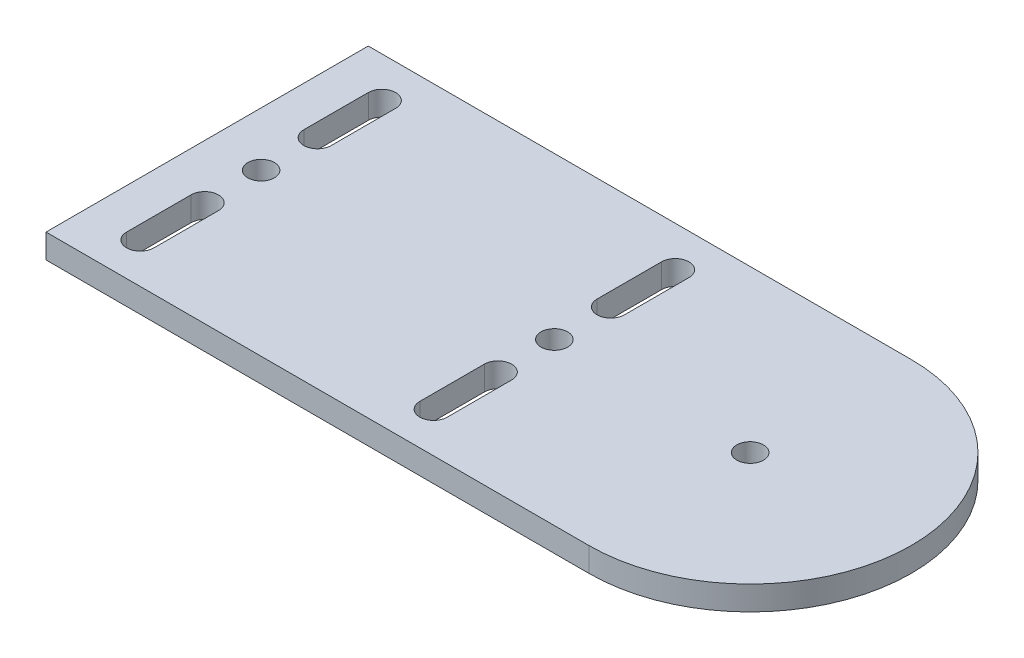
ISO-10303-21;
HEADER;
FILE_DESCRIPTION(('STEP AP214'),'2;1');
FILE_NAME('part.step','',(''),(''),'','','');
FILE_SCHEMA(('AUTOMOTIVE_DESIGN { 1 0 10303 214 1 1 1 1 }'));
ENDSEC;
DATA;
#1=APPLICATION_CONTEXT('core data for automotive mechanical design processes');
#2=APPLICATION_PROTOCOL_DEFINITION('international standard','automotive_design',2000,#1);
#3=PRODUCT_CONTEXT('',#1,'mechanical');
#4=PRODUCT('Part','Part','',(#3));
#5=PRODUCT_RELATED_PRODUCT_CATEGORY('part','',(#4));
#6=PRODUCT_DEFINITION_FORMATION('','',#4);
#7=PRODUCT_DEFINITION_CONTEXT('part definition',#1,'design');
#8=PRODUCT_DEFINITION('design','',#6,#7);
#9=PRODUCT_DEFINITION_SHAPE('','',#8);
#10=(LENGTH_UNIT() NAMED_UNIT(*) SI_UNIT(.MILLI.,.METRE.));
#11=(NAMED_UNIT(*) PLANE_ANGLE_UNIT() SI_UNIT($,.RADIAN.));
#12=(NAMED_UNIT(*) SI_UNIT($,.STERADIAN.) SOLID_ANGLE_UNIT());
#13=UNCERTAINTY_MEASURE_WITH_UNIT(LENGTH_MEASURE(1.E-05),#10,'distance_accuracy_value','');
#14=(GEOMETRIC_REPRESENTATION_CONTEXT(3) GLOBAL_UNCERTAINTY_ASSIGNED_CONTEXT((#13)) GLOBAL_UNIT_ASSIGNED_CONTEXT((#10,
#11,#12)) REPRESENTATION_CONTEXT('',''));
#15=CARTESIAN_POINT('',(0.,0.,0.));
#16=DIRECTION('',(0.,0.,1.));
#17=DIRECTION('',(1.,0.,0.));
#18=AXIS2_PLACEMENT_3D('',#15,#16,#17);
#19=CARTESIAN_POINT('',(0.,3.,0.));
#20=DIRECTION('',(0.,1.,0.));
#21=DIRECTION('',(0.,0.,1.));
#22=AXIS2_PLACEMENT_3D('',#19,#20,#21);
#23=PLANE('',#22);
#24=DIRECTION('',(0.,0.,-1.));
#25=VECTOR('',#24,1.);
#26=CARTESIAN_POINT('',(17.6,3.,0.));
#27=LINE('',#26,#25);
#28=CARTESIAN_POINT('',(17.6,3.,20.));
#29=VERTEX_POINT('',#28);
#30=CARTESIAN_POINT('',(17.6,3.,-20.));
#31=VERTEX_POINT('',#30);
#32=EDGE_CURVE('E49',#29,#31,#27,.T.);
#33=ORIENTED_EDGE('',*,*,#32,.F.);
#34=DIRECTION('',(1.,0.,0.));
#35=VECTOR('',#34,1.);
#36=CARTESIAN_POINT('',(0.,3.,20.));
#37=LINE('',#36,#35);
#38=CARTESIAN_POINT('',(85.,3.,20.));
#39=VERTEX_POINT('',#38);
#40=EDGE_CURVE('E182',#29,#39,#37,.T.);
#41=ORIENTED_EDGE('',*,*,#40,.T.);
#42=CARTESIAN_POINT('',(85.,3.,0.));
#43=DIRECTION('',(0.,1.,0.));
#44=DIRECTION('',(0.,0.,1.));
#45=AXIS2_PLACEMENT_3D('',#42,#43,#44);
#46=CIRCLE('',#45,20.);
#47=CARTESIAN_POINT('',(85.,3.,-20.));
#48=VERTEX_POINT('',#47);
#49=EDGE_CURVE('E339',#39,#48,#46,.T.);
#50=ORIENTED_EDGE('',*,*,#49,.T.);
#51=DIRECTION('',(-1.,0.,0.));
#52=VECTOR('',#51,1.);
#53=CARTESIAN_POINT('',(0.,3.,-20.));
#54=LINE('',#53,#52);
#55=EDGE_CURVE('E196',#48,#31,#54,.T.);
#56=ORIENTED_EDGE('',*,*,#55,.T.);
#57=EDGE_LOOP('',(#33,#41,#50,#56));
#58=FACE_BOUND('',#57,.T.);
#59=CARTESIAN_POINT('',(24.3,3.,0.));
#60=DIRECTION('',(0.,1.,0.));
#61=DIRECTION('',(0.,0.,1.));
#62=AXIS2_PLACEMENT_3D('',#59,#60,#61);
#63=CIRCLE('',#62,1.65);
#64=CARTESIAN_POINT('',(24.3,3.,1.65000000000001));
#65=VERTEX_POINT('',#64);
#66=EDGE_CURVE('E207',#65,#65,#63,.T.);
#67=ORIENTED_EDGE('',*,*,#66,.F.);
#68=EDGE_LOOP('',(#67));
#69=FACE_BOUND('',#68,.T.);
#70=CARTESIAN_POINT('',(60.7,3.,0.));
#71=DIRECTION('',(0.,1.,0.));
#72=DIRECTION('',(0.,0.,1.));
#73=AXIS2_PLACEMENT_3D('',#70,#71,#72);
#74=CIRCLE('',#73,1.65);
#75=CARTESIAN_POINT('',(60.7,3.,1.65000000000001));
#76=VERTEX_POINT('',#75);
#77=EDGE_CURVE('E588',#76,#76,#74,.T.);
#78=ORIENTED_EDGE('',*,*,#77,.F.);
#79=EDGE_LOOP('',(#78));
#80=FACE_BOUND('',#79,.T.);
#81=DIRECTION('',(0.,0.,1.));
#82=VECTOR('',#81,1.);
#83=CARTESIAN_POINT('',(59.,3.,-15.));
#84=LINE('',#83,#82);
#85=CARTESIAN_POINT('',(59.,3.,-15.));
#86=VERTEX_POINT('',#85);
#87=CARTESIAN_POINT('',(59.,3.,-7.));
#88=VERTEX_POINT('',#87);
#89=EDGE_CURVE('E224',#86,#88,#84,.T.);
#90=ORIENTED_EDGE('',*,*,#89,.F.);
#91=CARTESIAN_POINT('',(60.7,3.,-15.));
#92=DIRECTION('',(0.,1.,0.));
#93=DIRECTION('',(0.,0.,-1.));
#94=AXIS2_PLACEMENT_3D('',#91,#92,#93);
#95=CIRCLE('',#94,1.70000000000001);
#96=CARTESIAN_POINT('',(62.4,3.,-15.));
#97=VERTEX_POINT('',#96);
#98=EDGE_CURVE('E222',#97,#86,#95,.T.);
#99=ORIENTED_EDGE('',*,*,#98,.F.);
#100=DIRECTION('',(0.,0.,-1.));
#101=VECTOR('',#100,1.);
#102=CARTESIAN_POINT('',(62.4,3.,-15.));
#103=LINE('',#102,#101);
#104=CARTESIAN_POINT('',(62.4,3.,-7.));
#105=VERTEX_POINT('',#104);
#106=EDGE_CURVE('E229',#105,#97,#103,.T.);
#107=ORIENTED_EDGE('',*,*,#106,.F.);
#108=CARTESIAN_POINT('',(60.7,3.,-7.));
#109=DIRECTION('',(0.,1.,0.));
#110=DIRECTION('',(0.,0.,-1.));
#111=AXIS2_PLACEMENT_3D('',#108,#109,#110);
#112=CIRCLE('',#111,1.70000000000001);
#113=EDGE_CURVE('E227',#88,#105,#112,.T.);
#114=ORIENTED_EDGE('',*,*,#113,.F.);
#115=EDGE_LOOP('',(#90,#99,#107,#114));
#116=FACE_BOUND('',#115,.T.);
#117=DIRECTION('',(0.,0.,1.));
#118=VECTOR('',#117,1.);
#119=CARTESIAN_POINT('',(59.,3.,7.));
#120=LINE('',#119,#118);
#121=CARTESIAN_POINT('',(59.,3.,7.));
#122=VERTEX_POINT('',#121);
#123=CARTESIAN_POINT('',(59.,3.,15.));
#124=VERTEX_POINT('',#123);
#125=EDGE_CURVE('E253',#122,#124,#120,.T.);
#126=ORIENTED_EDGE('',*,*,#125,.F.);
#127=CARTESIAN_POINT('',(60.7,3.,6.99999999999999));
#128=DIRECTION('',(0.,1.,0.));
#129=DIRECTION('',(0.,0.,-1.));
#130=AXIS2_PLACEMENT_3D('',#127,#128,#129);
#131=CIRCLE('',#130,1.70000000000001);
#132=CARTESIAN_POINT('',(62.4,3.,7.));
#133=VERTEX_POINT('',#132);
#134=EDGE_CURVE('E251',#133,#122,#131,.T.);
#135=ORIENTED_EDGE('',*,*,#134,.F.);
#136=DIRECTION('',(0.,0.,-1.));
#137=VECTOR('',#136,1.);
#138=CARTESIAN_POINT('',(62.4,3.,7.));
#139=LINE('',#138,#137);
#140=CARTESIAN_POINT('',(62.4,3.,15.));
#141=VERTEX_POINT('',#140);
#142=EDGE_CURVE('E259',#141,#133,#139,.T.);
#143=ORIENTED_EDGE('',*,*,#142,.F.);
#144=CARTESIAN_POINT('',(60.7,3.,15.));
#145=DIRECTION('',(0.,1.,0.));
#146=DIRECTION('',(0.,0.,-1.));
#147=AXIS2_PLACEMENT_3D('',#144,#145,#146);
#148=CIRCLE('',#147,1.70000000000001);
#149=EDGE_CURVE('E256',#124,#141,#148,.T.);
#150=ORIENTED_EDGE('',*,*,#149,.F.);
#151=EDGE_LOOP('',(#126,#135,#143,#150));
#152=FACE_BOUND('',#151,.T.);
#153=DIRECTION('',(0.,0.,1.));
#154=VECTOR('',#153,1.);
#155=CARTESIAN_POINT('',(22.6,3.,7.00000000000002));
#156=LINE('',#155,#154);
#157=CARTESIAN_POINT('',(22.6,3.,7.00000000000002));
#158=VERTEX_POINT('',#157);
#159=CARTESIAN_POINT('',(22.6,3.,15.));
#160=VERTEX_POINT('',#159);
#161=EDGE_CURVE('E284',#158,#160,#156,.T.);
#162=ORIENTED_EDGE('',*,*,#161,.F.);
#163=CARTESIAN_POINT('',(24.3,3.,7.));
#164=DIRECTION('',(0.,1.,0.));
#165=DIRECTION('',(0.,0.,1.));
#166=AXIS2_PLACEMENT_3D('',#163,#164,#165);
#167=CIRCLE('',#166,1.70000000000001);
#168=CARTESIAN_POINT('',(26.,3.,7.));
#169=VERTEX_POINT('',#168);
#170=EDGE_CURVE('E282',#169,#158,#167,.T.);
#171=ORIENTED_EDGE('',*,*,#170,.F.);
#172=DIRECTION('',(0.,0.,-1.));
#173=VECTOR('',#172,1.);
#174=CARTESIAN_POINT('',(26.,3.,7.));
#175=LINE('',#174,#173);
#176=CARTESIAN_POINT('',(26.,3.,15.));
#177=VERTEX_POINT('',#176);
#178=EDGE_CURVE('E290',#177,#169,#175,.T.);
#179=ORIENTED_EDGE('',*,*,#178,.F.);
#180=CARTESIAN_POINT('',(24.3,3.,15.));
#181=DIRECTION('',(0.,1.,0.));
#182=DIRECTION('',(0.,0.,1.));
#183=AXIS2_PLACEMENT_3D('',#180,#181,#182);
#184=CIRCLE('',#183,1.70000000000001);
#185=EDGE_CURVE('E287',#160,#177,#184,.T.);
#186=ORIENTED_EDGE('',*,*,#185,.F.);
#187=EDGE_LOOP('',(#162,#171,#179,#186));
#188=FACE_BOUND('',#187,.T.);
#189=DIRECTION('',(0.,0.,1.));
#190=VECTOR('',#189,1.);
#191=CARTESIAN_POINT('',(22.6,3.,-15.));
#192=LINE('',#191,#190);
#193=CARTESIAN_POINT('',(22.6,3.,-15.));
#194=VERTEX_POINT('',#193);
#195=CARTESIAN_POINT('',(22.6,3.,-7.));
#196=VERTEX_POINT('',#195);
#197=EDGE_CURVE('E315',#194,#196,#192,.T.);
#198=ORIENTED_EDGE('',*,*,#197,.F.);
#199=CARTESIAN_POINT('',(24.3,3.,-15.));
#200=DIRECTION('',(0.,1.,0.));
#201=DIRECTION('',(0.,0.,1.));
#202=AXIS2_PLACEMENT_3D('',#199,#200,#201);
#203=CIRCLE('',#202,1.70000000000001);
#204=CARTESIAN_POINT('',(26.,3.,-15.));
#205=VERTEX_POINT('',#204);
#206=EDGE_CURVE('E313',#205,#194,#203,.T.);
#207=ORIENTED_EDGE('',*,*,#206,.F.);
#208=DIRECTION('',(0.,0.,-1.));
#209=VECTOR('',#208,1.);
#210=CARTESIAN_POINT('',(26.,3.,-15.));
#211=LINE('',#210,#209);
#212=CARTESIAN_POINT('',(26.,3.,-7.));
#213=VERTEX_POINT('',#212);
#214=EDGE_CURVE('E321',#213,#205,#211,.T.);
#215=ORIENTED_EDGE('',*,*,#214,.F.);
#216=CARTESIAN_POINT('',(24.3,3.,-7.));
#217=DIRECTION('',(0.,1.,0.));
#218=DIRECTION('',(0.,0.,1.));
#219=AXIS2_PLACEMENT_3D('',#216,#217,#218);
#220=CIRCLE('',#219,1.70000000000001);
#221=EDGE_CURVE('E318',#196,#213,#220,.T.);
#222=ORIENTED_EDGE('',*,*,#221,.F.);
#223=EDGE_LOOP('',(#198,#207,#215,#222));
#224=FACE_BOUND('',#223,.T.);
#225=CARTESIAN_POINT('',(85.,3.,0.));
#226=DIRECTION('',(0.,1.,0.));
#227=DIRECTION('',(0.,0.,1.));
#228=AXIS2_PLACEMENT_3D('',#225,#226,#227);
#229=CIRCLE('',#228,1.65000000000002);
#230=CARTESIAN_POINT('',(85.,3.,1.65000000000002));
#231=VERTEX_POINT('',#230);
#232=EDGE_CURVE('E213',#231,#231,#229,.T.);
#233=ORIENTED_EDGE('',*,*,#232,.F.);
#234=EDGE_LOOP('',(#233));
#235=FACE_BOUND('',#234,.T.);
#236=ADVANCED_FACE('F34',(#58,#69,#80,#116,#152,#188,#224,#235),#23,.T.);
#237=CARTESIAN_POINT('',(0.,0.,0.));
#238=DIRECTION('',(0.,1.,0.));
#239=DIRECTION('',(0.,0.,1.));
#240=AXIS2_PLACEMENT_3D('',#237,#238,#239);
#241=PLANE('',#240);
#242=CARTESIAN_POINT('',(24.3,0.,0.));
#243=DIRECTION('',(0.,1.,0.));
#244=DIRECTION('',(0.,0.,1.));
#245=AXIS2_PLACEMENT_3D('',#242,#243,#244);
#246=CIRCLE('',#245,1.65);
#247=CARTESIAN_POINT('',(24.3,0.,1.65000000000001));
#248=VERTEX_POINT('',#247);
#249=EDGE_CURVE('E206',#248,#248,#246,.T.);
#250=ORIENTED_EDGE('',*,*,#249,.T.);
#251=EDGE_LOOP('',(#250));
#252=FACE_BOUND('',#251,.T.);
#253=CARTESIAN_POINT('',(60.7,0.,0.));
#254=DIRECTION('',(0.,1.,0.));
#255=DIRECTION('',(0.,0.,1.));
#256=AXIS2_PLACEMENT_3D('',#253,#254,#255);
#257=CIRCLE('',#256,1.65);
#258=CARTESIAN_POINT('',(60.7,0.,1.65000000000001));
#259=VERTEX_POINT('',#258);
#260=EDGE_CURVE('E204',#259,#259,#257,.T.);
#261=ORIENTED_EDGE('',*,*,#260,.T.);
#262=EDGE_LOOP('',(#261));
#263=FACE_BOUND('',#262,.T.);
#264=CARTESIAN_POINT('',(60.7,0.,6.99999999999999));
#265=DIRECTION('',(0.,1.,0.));
#266=DIRECTION('',(0.,0.,-1.));
#267=AXIS2_PLACEMENT_3D('',#264,#265,#266);
#268=CIRCLE('',#267,1.70000000000001);
#269=CARTESIAN_POINT('',(62.4,0.,7.));
#270=VERTEX_POINT('',#269);
#271=CARTESIAN_POINT('',(59.,0.,7.));
#272=VERTEX_POINT('',#271);
#273=EDGE_CURVE('E250',#270,#272,#268,.T.);
#274=ORIENTED_EDGE('',*,*,#273,.T.);
#275=DIRECTION('',(0.,0.,1.));
#276=VECTOR('',#275,1.);
#277=CARTESIAN_POINT('',(59.,0.,7.));
#278=LINE('',#277,#276);
#279=CARTESIAN_POINT('',(59.,0.,15.));
#280=VERTEX_POINT('',#279);
#281=EDGE_CURVE('E264',#272,#280,#278,.T.);
#282=ORIENTED_EDGE('',*,*,#281,.T.);
#283=CARTESIAN_POINT('',(60.7,0.,15.));
#284=DIRECTION('',(0.,1.,0.));
#285=DIRECTION('',(0.,0.,-1.));
#286=AXIS2_PLACEMENT_3D('',#283,#284,#285);
#287=CIRCLE('',#286,1.70000000000001);
#288=CARTESIAN_POINT('',(62.4,0.,15.));
#289=VERTEX_POINT('',#288);
#290=EDGE_CURVE('E267',#280,#289,#287,.T.);
#291=ORIENTED_EDGE('',*,*,#290,.T.);
#292=DIRECTION('',(0.,0.,-1.));
#293=VECTOR('',#292,1.);
#294=CARTESIAN_POINT('',(62.4,0.,7.));
#295=LINE('',#294,#293);
#296=EDGE_CURVE('E254',#289,#270,#295,.T.);
#297=ORIENTED_EDGE('',*,*,#296,.T.);
#298=EDGE_LOOP('',(#274,#282,#291,#297));
#299=FACE_BOUND('',#298,.T.);
#300=CARTESIAN_POINT('',(24.3,0.,-15.));
#301=DIRECTION('',(0.,1.,0.));
#302=DIRECTION('',(0.,0.,1.));
#303=AXIS2_PLACEMENT_3D('',#300,#301,#302);
#304=CIRCLE('',#303,1.70000000000001);
#305=CARTESIAN_POINT('',(26.,0.,-15.));
#306=VERTEX_POINT('',#305);
#307=CARTESIAN_POINT('',(22.6,0.,-15.));
#308=VERTEX_POINT('',#307);
#309=EDGE_CURVE('E312',#306,#308,#304,.T.);
#310=ORIENTED_EDGE('',*,*,#309,.T.);
#311=DIRECTION('',(0.,0.,1.));
#312=VECTOR('',#311,1.);
#313=CARTESIAN_POINT('',(22.6,0.,-15.));
#314=LINE('',#313,#312);
#315=CARTESIAN_POINT('',(22.6,0.,-7.));
#316=VERTEX_POINT('',#315);
#317=EDGE_CURVE('E326',#308,#316,#314,.T.);
#318=ORIENTED_EDGE('',*,*,#317,.T.);
#319=CARTESIAN_POINT('',(24.3,0.,-7.));
#320=DIRECTION('',(0.,1.,0.));
#321=DIRECTION('',(0.,0.,1.));
#322=AXIS2_PLACEMENT_3D('',#319,#320,#321);
#323=CIRCLE('',#322,1.70000000000001);
#324=CARTESIAN_POINT('',(26.,0.,-7.));
#325=VERTEX_POINT('',#324);
#326=EDGE_CURVE('E329',#316,#325,#323,.T.);
#327=ORIENTED_EDGE('',*,*,#326,.T.);
#328=DIRECTION('',(0.,0.,-1.));
#329=VECTOR('',#328,1.);
#330=CARTESIAN_POINT('',(26.,0.,-15.));
#331=LINE('',#330,#329);
#332=EDGE_CURVE('E316',#325,#306,#331,.T.);
#333=ORIENTED_EDGE('',*,*,#332,.T.);
#334=EDGE_LOOP('',(#310,#318,#327,#333));
#335=FACE_BOUND('',#334,.T.);
#336=DIRECTION('',(1.,0.,0.));
#337=VECTOR('',#336,1.);
#338=CARTESIAN_POINT('',(0.,0.,20.));
#339=LINE('',#338,#337);
#340=CARTESIAN_POINT('',(17.6,0.,20.));
#341=VERTEX_POINT('',#340);
#342=CARTESIAN_POINT('',(85.,0.,20.));
#343=VERTEX_POINT('',#342);
#344=EDGE_CURVE('E180',#341,#343,#339,.T.);
#345=ORIENTED_EDGE('',*,*,#344,.F.);
#346=DIRECTION('',(0.,0.,1.));
#347=VECTOR('',#346,1.);
#348=CARTESIAN_POINT('',(17.6,0.,20.));
#349=LINE('',#348,#347);
#350=CARTESIAN_POINT('',(17.6,0.,-20.));
#351=VERTEX_POINT('',#350);
#352=EDGE_CURVE('E168',#351,#341,#349,.T.);
#353=ORIENTED_EDGE('',*,*,#352,.F.);
#354=DIRECTION('',(-1.,0.,0.));
#355=VECTOR('',#354,1.);
#356=CARTESIAN_POINT('',(0.,0.,-20.));
#357=LINE('',#356,#355);
#358=CARTESIAN_POINT('',(85.,0.,-20.));
#359=VERTEX_POINT('',#358);
#360=EDGE_CURVE('E190',#359,#351,#357,.T.);
#361=ORIENTED_EDGE('',*,*,#360,.F.);
#362=CARTESIAN_POINT('',(85.,0.,0.));
#363=DIRECTION('',(0.,1.,0.));
#364=DIRECTION('',(0.,0.,1.));
#365=AXIS2_PLACEMENT_3D('',#362,#363,#364);
#366=CIRCLE('',#365,20.);
#367=EDGE_CURVE('E187',#343,#359,#366,.T.);
#368=ORIENTED_EDGE('',*,*,#367,.F.);
#369=EDGE_LOOP('',(#345,#353,#361,#368));
#370=FACE_BOUND('',#369,.T.);
#371=CARTESIAN_POINT('',(24.3,0.,7.));
#372=DIRECTION('',(0.,1.,0.));
#373=DIRECTION('',(0.,0.,1.));
#374=AXIS2_PLACEMENT_3D('',#371,#372,#373);
#375=CIRCLE('',#374,1.70000000000001);
#376=CARTESIAN_POINT('',(26.,0.,7.));
#377=VERTEX_POINT('',#376);
#378=CARTESIAN_POINT('',(22.6,0.,7.00000000000002));
#379=VERTEX_POINT('',#378);
#380=EDGE_CURVE('E281',#377,#379,#375,.T.);
#381=ORIENTED_EDGE('',*,*,#380,.T.);
#382=DIRECTION('',(0.,0.,1.));
#383=VECTOR('',#382,1.);
#384=CARTESIAN_POINT('',(22.6,0.,7.00000000000002));
#385=LINE('',#384,#383);
#386=CARTESIAN_POINT('',(22.6,0.,15.));
#387=VERTEX_POINT('',#386);
#388=EDGE_CURVE('E295',#379,#387,#385,.T.);
#389=ORIENTED_EDGE('',*,*,#388,.T.);
#390=CARTESIAN_POINT('',(24.3,0.,15.));
#391=DIRECTION('',(0.,1.,0.));
#392=DIRECTION('',(0.,0.,1.));
#393=AXIS2_PLACEMENT_3D('',#390,#391,#392);
#394=CIRCLE('',#393,1.70000000000001);
#395=CARTESIAN_POINT('',(26.,0.,15.));
#396=VERTEX_POINT('',#395);
#397=EDGE_CURVE('E298',#387,#396,#394,.T.);
#398=ORIENTED_EDGE('',*,*,#397,.T.);
#399=DIRECTION('',(0.,0.,-1.));
#400=VECTOR('',#399,1.);
#401=CARTESIAN_POINT('',(26.,0.,7.));
#402=LINE('',#401,#400);
#403=EDGE_CURVE('E285',#396,#377,#402,.T.);
#404=ORIENTED_EDGE('',*,*,#403,.T.);
#405=EDGE_LOOP('',(#381,#389,#398,#404));
#406=FACE_BOUND('',#405,.T.);
#407=CARTESIAN_POINT('',(60.7,0.,-15.));
#408=DIRECTION('',(0.,1.,0.));
#409=DIRECTION('',(0.,0.,-1.));
#410=AXIS2_PLACEMENT_3D('',#407,#408,#409);
#411=CIRCLE('',#410,1.70000000000001);
#412=CARTESIAN_POINT('',(62.4,0.,-15.));
#413=VERTEX_POINT('',#412);
#414=CARTESIAN_POINT('',(59.,0.,-15.));
#415=VERTEX_POINT('',#414);
#416=EDGE_CURVE('E218',#413,#415,#411,.T.);
#417=ORIENTED_EDGE('',*,*,#416,.T.);
#418=DIRECTION('',(0.,0.,1.));
#419=VECTOR('',#418,1.);
#420=CARTESIAN_POINT('',(59.,0.,-15.));
#421=LINE('',#420,#419);
#422=CARTESIAN_POINT('',(59.,0.,-7.));
#423=VERTEX_POINT('',#422);
#424=EDGE_CURVE('E234',#415,#423,#421,.T.);
#425=ORIENTED_EDGE('',*,*,#424,.T.);
#426=CARTESIAN_POINT('',(60.7,0.,-7.));
#427=DIRECTION('',(0.,1.,0.));
#428=DIRECTION('',(0.,0.,-1.));
#429=AXIS2_PLACEMENT_3D('',#426,#427,#428);
#430=CIRCLE('',#429,1.70000000000001);
#431=CARTESIAN_POINT('',(62.4,0.,-7.));
#432=VERTEX_POINT('',#431);
#433=EDGE_CURVE('E237',#423,#432,#430,.T.);
#434=ORIENTED_EDGE('',*,*,#433,.T.);
#435=DIRECTION('',(0.,0.,-1.));
#436=VECTOR('',#435,1.);
#437=CARTESIAN_POINT('',(62.4,0.,-15.));
#438=LINE('',#437,#436);
#439=EDGE_CURVE('E225',#432,#413,#438,.T.);
#440=ORIENTED_EDGE('',*,*,#439,.T.);
#441=EDGE_LOOP('',(#417,#425,#434,#440));
#442=FACE_BOUND('',#441,.T.);
#443=CARTESIAN_POINT('',(85.,0.,0.));
#444=DIRECTION('',(0.,1.,0.));
#445=DIRECTION('',(0.,0.,1.));
#446=AXIS2_PLACEMENT_3D('',#443,#444,#445);
#447=CIRCLE('',#446,1.65000000000002);
#448=CARTESIAN_POINT('',(85.,0.,1.65000000000002));
#449=VERTEX_POINT('',#448);
#450=EDGE_CURVE('E209',#449,#449,#447,.T.);
#451=ORIENTED_EDGE('',*,*,#450,.T.);
#452=EDGE_LOOP('',(#451));
#453=FACE_BOUND('',#452,.T.);
#454=ADVANCED_FACE('F185',(#252,#263,#299,#335,#370,#406,#442,#453),#241,.F.);
#455=CARTESIAN_POINT('',(0.,3.,20.));
#456=DIRECTION('',(0.,0.,-1.));
#457=DIRECTION('',(-1.,0.,0.));
#458=AXIS2_PLACEMENT_3D('',#455,#456,#457);
#459=PLANE('',#458);
#460=ORIENTED_EDGE('',*,*,#40,.F.);
#461=DIRECTION('',(0.,-1.,0.));
#462=VECTOR('',#461,1.);
#463=CARTESIAN_POINT('',(17.6,10.,20.));
#464=LINE('',#463,#462);
#465=EDGE_CURVE('E171',#29,#341,#464,.T.);
#466=ORIENTED_EDGE('',*,*,#465,.T.);
#467=ORIENTED_EDGE('',*,*,#344,.T.);
#468=DIRECTION('',(0.,-1.,0.));
#469=VECTOR('',#468,1.);
#470=CARTESIAN_POINT('',(85.,3.,20.));
#471=LINE('',#470,#469);
#472=EDGE_CURVE('E42',#39,#343,#471,.T.);
#473=ORIENTED_EDGE('',*,*,#472,.F.);
#474=EDGE_LOOP('',(#460,#466,#467,#473));
#475=FACE_BOUND('',#474,.T.);
#476=ADVANCED_FACE('F36',(#475),#459,.F.);
#477=CARTESIAN_POINT('',(85.,3.,0.));
#478=DIRECTION('',(0.,-1.,0.));
#479=DIRECTION('',(0.,0.,-1.));
#480=AXIS2_PLACEMENT_3D('',#477,#478,#479);
#481=CYLINDRICAL_SURFACE('',#480,20.);
#482=ORIENTED_EDGE('',*,*,#367,.T.);
#483=DIRECTION('',(0.,-1.,0.));
#484=VECTOR('',#483,1.);
#485=CARTESIAN_POINT('',(85.,3.,-20.));
#486=LINE('',#485,#484);
#487=EDGE_CURVE('E200',#48,#359,#486,.T.);
#488=ORIENTED_EDGE('',*,*,#487,.F.);
#489=ORIENTED_EDGE('',*,*,#49,.F.);
#490=ORIENTED_EDGE('',*,*,#472,.T.);
#491=EDGE_LOOP('',(#482,#488,#489,#490));
#492=FACE_BOUND('',#491,.T.);
#493=ADVANCED_FACE('F349',(#492),#481,.T.);
#494=CARTESIAN_POINT('',(0.,3.,-20.));
#495=DIRECTION('',(0.,0.,1.));
#496=DIRECTION('',(1.,0.,0.));
#497=AXIS2_PLACEMENT_3D('',#494,#495,#496);
#498=PLANE('',#497);
#499=ORIENTED_EDGE('',*,*,#360,.T.);
#500=DIRECTION('',(0.,1.,0.));
#501=VECTOR('',#500,1.);
#502=CARTESIAN_POINT('',(17.6,3.,-20.));
#503=LINE('',#502,#501);
#504=EDGE_CURVE('E11',#351,#31,#503,.T.);
#505=ORIENTED_EDGE('',*,*,#504,.T.);
#506=ORIENTED_EDGE('',*,*,#55,.F.);
#507=ORIENTED_EDGE('',*,*,#487,.T.);
#508=EDGE_LOOP('',(#499,#505,#506,#507));
#509=FACE_BOUND('',#508,.T.);
#510=ADVANCED_FACE('F347',(#509),#498,.F.);
#511=CARTESIAN_POINT('',(24.3,3.,-15.));
#512=DIRECTION('',(0.,-1.,0.));
#513=DIRECTION('',(0.,0.,-1.));
#514=AXIS2_PLACEMENT_3D('',#511,#512,#513);
#515=CYLINDRICAL_SURFACE('',#514,1.70000000000001);
#516=ORIENTED_EDGE('',*,*,#309,.F.);
#517=DIRECTION('',(0.,-1.,0.));
#518=VECTOR('',#517,1.);
#519=CARTESIAN_POINT('',(26.,3.,-15.));
#520=LINE('',#519,#518);
#521=EDGE_CURVE('E323',#205,#306,#520,.T.);
#522=ORIENTED_EDGE('',*,*,#521,.F.);
#523=ORIENTED_EDGE('',*,*,#206,.T.);
#524=DIRECTION('',(0.,-1.,0.));
#525=VECTOR('',#524,1.);
#526=CARTESIAN_POINT('',(22.6,3.,-15.));
#527=LINE('',#526,#525);
#528=EDGE_CURVE('E188',#194,#308,#527,.T.);
#529=ORIENTED_EDGE('',*,*,#528,.T.);
#530=EDGE_LOOP('',(#516,#522,#523,#529));
#531=FACE_BOUND('',#530,.T.);
#532=ADVANCED_FACE('F355',(#531),#515,.F.);
#533=CARTESIAN_POINT('',(22.6,3.,-15.));
#534=DIRECTION('',(1.,0.,0.));
#535=DIRECTION('',(0.,0.,-1.));
#536=AXIS2_PLACEMENT_3D('',#533,#534,#535);
#537=PLANE('',#536);
#538=ORIENTED_EDGE('',*,*,#317,.F.);
#539=ORIENTED_EDGE('',*,*,#528,.F.);
#540=ORIENTED_EDGE('',*,*,#197,.T.);
#541=DIRECTION('',(0.,-1.,0.));
#542=VECTOR('',#541,1.);
#543=CARTESIAN_POINT('',(22.6,3.,-7.));
#544=LINE('',#543,#542);
#545=EDGE_CURVE('E193',#196,#316,#544,.T.);
#546=ORIENTED_EDGE('',*,*,#545,.T.);
#547=EDGE_LOOP('',(#538,#539,#540,#546));
#548=FACE_BOUND('',#547,.T.);
#549=ADVANCED_FACE('F366',(#548),#537,.T.);
#550=CARTESIAN_POINT('',(24.3,3.,-7.));
#551=DIRECTION('',(0.,-1.,0.));
#552=DIRECTION('',(0.,0.,-1.));
#553=AXIS2_PLACEMENT_3D('',#550,#551,#552);
#554=CYLINDRICAL_SURFACE('',#553,1.70000000000001);
#555=ORIENTED_EDGE('',*,*,#326,.F.);
#556=ORIENTED_EDGE('',*,*,#545,.F.);
#557=ORIENTED_EDGE('',*,*,#221,.T.);
#558=DIRECTION('',(0.,-1.,0.));
#559=VECTOR('',#558,1.);
#560=CARTESIAN_POINT('',(26.,3.,-7.));
#561=LINE('',#560,#559);
#562=EDGE_CURVE('E336',#213,#325,#561,.T.);
#563=ORIENTED_EDGE('',*,*,#562,.T.);
#564=EDGE_LOOP('',(#555,#556,#557,#563));
#565=FACE_BOUND('',#564,.T.);
#566=ADVANCED_FACE('F370',(#565),#554,.F.);
#567=CARTESIAN_POINT('',(26.,3.,-15.));
#568=DIRECTION('',(-1.,0.,0.));
#569=DIRECTION('',(0.,0.,1.));
#570=AXIS2_PLACEMENT_3D('',#567,#568,#569);
#571=PLANE('',#570);
#572=ORIENTED_EDGE('',*,*,#332,.F.);
#573=ORIENTED_EDGE('',*,*,#562,.F.);
#574=ORIENTED_EDGE('',*,*,#214,.T.);
#575=ORIENTED_EDGE('',*,*,#521,.T.);
#576=EDGE_LOOP('',(#572,#573,#574,#575));
#577=FACE_BOUND('',#576,.T.);
#578=ADVANCED_FACE('F374',(#577),#571,.T.);
#579=CARTESIAN_POINT('',(24.3,3.,7.));
#580=DIRECTION('',(0.,-1.,0.));
#581=DIRECTION('',(0.,0.,-1.));
#582=AXIS2_PLACEMENT_3D('',#579,#580,#581);
#583=CYLINDRICAL_SURFACE('',#582,1.70000000000001);
#584=ORIENTED_EDGE('',*,*,#380,.F.);
#585=DIRECTION('',(0.,-1.,0.));
#586=VECTOR('',#585,1.);
#587=CARTESIAN_POINT('',(26.,3.,7.));
#588=LINE('',#587,#586);
#589=EDGE_CURVE('E292',#169,#377,#588,.T.);
#590=ORIENTED_EDGE('',*,*,#589,.F.);
#591=ORIENTED_EDGE('',*,*,#170,.T.);
#592=DIRECTION('',(0.,-1.,0.));
#593=VECTOR('',#592,1.);
#594=CARTESIAN_POINT('',(22.6,3.,7.00000000000002));
#595=LINE('',#594,#593);
#596=EDGE_CURVE('E309',#158,#379,#595,.T.);
#597=ORIENTED_EDGE('',*,*,#596,.T.);
#598=EDGE_LOOP('',(#584,#590,#591,#597));
#599=FACE_BOUND('',#598,.T.);
#600=ADVANCED_FACE('F378',(#599),#583,.F.);
#601=CARTESIAN_POINT('',(22.6,3.,7.00000000000002));
#602=DIRECTION('',(1.,0.,0.));
#603=DIRECTION('',(0.,0.,-1.));
#604=AXIS2_PLACEMENT_3D('',#601,#602,#603);
#605=PLANE('',#604);
#606=ORIENTED_EDGE('',*,*,#388,.F.);
#607=ORIENTED_EDGE('',*,*,#596,.F.);
#608=ORIENTED_EDGE('',*,*,#161,.T.);
#609=DIRECTION('',(0.,-1.,0.));
#610=VECTOR('',#609,1.);
#611=CARTESIAN_POINT('',(22.6,3.,15.));
#612=LINE('',#611,#610);
#613=EDGE_CURVE('E307',#160,#387,#612,.T.);
#614=ORIENTED_EDGE('',*,*,#613,.T.);
#615=EDGE_LOOP('',(#606,#607,#608,#614));
#616=FACE_BOUND('',#615,.T.);
#617=ADVANCED_FACE('F382',(#616),#605,.T.);
#618=CARTESIAN_POINT('',(24.3,3.,15.));
#619=DIRECTION('',(0.,-1.,0.));
#620=DIRECTION('',(0.,0.,-1.));
#621=AXIS2_PLACEMENT_3D('',#618,#619,#620);
#622=CYLINDRICAL_SURFACE('',#621,1.70000000000001);
#623=ORIENTED_EDGE('',*,*,#397,.F.);
#624=ORIENTED_EDGE('',*,*,#613,.F.);
#625=ORIENTED_EDGE('',*,*,#185,.T.);
#626=DIRECTION('',(0.,-1.,0.));
#627=VECTOR('',#626,1.);
#628=CARTESIAN_POINT('',(26.,3.,15.));
#629=LINE('',#628,#627);
#630=EDGE_CURVE('E305',#177,#396,#629,.T.);
#631=ORIENTED_EDGE('',*,*,#630,.T.);
#632=EDGE_LOOP('',(#623,#624,#625,#631));
#633=FACE_BOUND('',#632,.T.);
#634=ADVANCED_FACE('F386',(#633),#622,.F.);
#635=CARTESIAN_POINT('',(26.,3.,7.));
#636=DIRECTION('',(-1.,0.,0.));
#637=DIRECTION('',(0.,0.,1.));
#638=AXIS2_PLACEMENT_3D('',#635,#636,#637);
#639=PLANE('',#638);
#640=ORIENTED_EDGE('',*,*,#403,.F.);
#641=ORIENTED_EDGE('',*,*,#630,.F.);
#642=ORIENTED_EDGE('',*,*,#178,.T.);
#643=ORIENTED_EDGE('',*,*,#589,.T.);
#644=EDGE_LOOP('',(#640,#641,#642,#643));
#645=FACE_BOUND('',#644,.T.);
#646=ADVANCED_FACE('F390',(#645),#639,.T.);
#647=CARTESIAN_POINT('',(60.7,3.,6.99999999999999));
#648=DIRECTION('',(0.,-1.,0.));
#649=DIRECTION('',(0.,0.,-1.));
#650=AXIS2_PLACEMENT_3D('',#647,#648,#649);
#651=CYLINDRICAL_SURFACE('',#650,1.70000000000001);
#652=ORIENTED_EDGE('',*,*,#273,.F.);
#653=DIRECTION('',(0.,-1.,0.));
#654=VECTOR('',#653,1.);
#655=CARTESIAN_POINT('',(62.4,3.,7.));
#656=LINE('',#655,#654);
#657=EDGE_CURVE('E261',#133,#270,#656,.T.);
#658=ORIENTED_EDGE('',*,*,#657,.F.);
#659=ORIENTED_EDGE('',*,*,#134,.T.);
#660=DIRECTION('',(0.,-1.,0.));
#661=VECTOR('',#660,1.);
#662=CARTESIAN_POINT('',(59.,3.,7.));
#663=LINE('',#662,#661);
#664=EDGE_CURVE('E278',#122,#272,#663,.T.);
#665=ORIENTED_EDGE('',*,*,#664,.T.);
#666=EDGE_LOOP('',(#652,#658,#659,#665));
#667=FACE_BOUND('',#666,.T.);
#668=ADVANCED_FACE('F394',(#667),#651,.F.);
#669=CARTESIAN_POINT('',(59.,3.,7.));
#670=DIRECTION('',(1.,0.,0.));
#671=DIRECTION('',(0.,0.,-1.));
#672=AXIS2_PLACEMENT_3D('',#669,#670,#671);
#673=PLANE('',#672);
#674=ORIENTED_EDGE('',*,*,#281,.F.);
#675=ORIENTED_EDGE('',*,*,#664,.F.);
#676=ORIENTED_EDGE('',*,*,#125,.T.);
#677=DIRECTION('',(0.,-1.,0.));
#678=VECTOR('',#677,1.);
#679=CARTESIAN_POINT('',(59.,3.,15.));
#680=LINE('',#679,#678);
#681=EDGE_CURVE('E276',#124,#280,#680,.T.);
#682=ORIENTED_EDGE('',*,*,#681,.T.);
#683=EDGE_LOOP('',(#674,#675,#676,#682));
#684=FACE_BOUND('',#683,.T.);
#685=ADVANCED_FACE('F398',(#684),#673,.T.);
#686=CARTESIAN_POINT('',(60.7,3.,15.));
#687=DIRECTION('',(0.,-1.,0.));
#688=DIRECTION('',(0.,0.,-1.));
#689=AXIS2_PLACEMENT_3D('',#686,#687,#688);
#690=CYLINDRICAL_SURFACE('',#689,1.70000000000001);
#691=ORIENTED_EDGE('',*,*,#290,.F.);
#692=ORIENTED_EDGE('',*,*,#681,.F.);
#693=ORIENTED_EDGE('',*,*,#149,.T.);
#694=DIRECTION('',(0.,-1.,0.));
#695=VECTOR('',#694,1.);
#696=CARTESIAN_POINT('',(62.4,3.,15.));
#697=LINE('',#696,#695);
#698=EDGE_CURVE('E274',#141,#289,#697,.T.);
#699=ORIENTED_EDGE('',*,*,#698,.T.);
#700=EDGE_LOOP('',(#691,#692,#693,#699));
#701=FACE_BOUND('',#700,.T.);
#702=ADVANCED_FACE('F402',(#701),#690,.F.);
#703=CARTESIAN_POINT('',(62.4,3.,7.));
#704=DIRECTION('',(-1.,0.,0.));
#705=DIRECTION('',(0.,0.,1.));
#706=AXIS2_PLACEMENT_3D('',#703,#704,#705);
#707=PLANE('',#706);
#708=ORIENTED_EDGE('',*,*,#296,.F.);
#709=ORIENTED_EDGE('',*,*,#698,.F.);
#710=ORIENTED_EDGE('',*,*,#142,.T.);
#711=ORIENTED_EDGE('',*,*,#657,.T.);
#712=EDGE_LOOP('',(#708,#709,#710,#711));
#713=FACE_BOUND('',#712,.T.);
#714=ADVANCED_FACE('F406',(#713),#707,.T.);
#715=CARTESIAN_POINT('',(60.7,3.,-15.));
#716=DIRECTION('',(0.,-1.,0.));
#717=DIRECTION('',(0.,0.,-1.));
#718=AXIS2_PLACEMENT_3D('',#715,#716,#717);
#719=CYLINDRICAL_SURFACE('',#718,1.70000000000001);
#720=ORIENTED_EDGE('',*,*,#416,.F.);
#721=DIRECTION('',(0.,-1.,0.));
#722=VECTOR('',#721,1.);
#723=CARTESIAN_POINT('',(62.4,3.,-15.));
#724=LINE('',#723,#722);
#725=EDGE_CURVE('E231',#97,#413,#724,.T.);
#726=ORIENTED_EDGE('',*,*,#725,.F.);
#727=ORIENTED_EDGE('',*,*,#98,.T.);
#728=DIRECTION('',(0.,-1.,0.));
#729=VECTOR('',#728,1.);
#730=CARTESIAN_POINT('',(59.,3.,-15.));
#731=LINE('',#730,#729);
#732=EDGE_CURVE('E247',#86,#415,#731,.T.);
#733=ORIENTED_EDGE('',*,*,#732,.T.);
#734=EDGE_LOOP('',(#720,#726,#727,#733));
#735=FACE_BOUND('',#734,.T.);
#736=ADVANCED_FACE('F410',(#735),#719,.F.);
#737=CARTESIAN_POINT('',(59.,3.,-15.));
#738=DIRECTION('',(1.,0.,0.));
#739=DIRECTION('',(0.,0.,-1.));
#740=AXIS2_PLACEMENT_3D('',#737,#738,#739);
#741=PLANE('',#740);
#742=ORIENTED_EDGE('',*,*,#424,.F.);
#743=ORIENTED_EDGE('',*,*,#732,.F.);
#744=ORIENTED_EDGE('',*,*,#89,.T.);
#745=DIRECTION('',(0.,-1.,0.));
#746=VECTOR('',#745,1.);
#747=CARTESIAN_POINT('',(59.,3.,-7.));
#748=LINE('',#747,#746);
#749=EDGE_CURVE('E245',#88,#423,#748,.T.);
#750=ORIENTED_EDGE('',*,*,#749,.T.);
#751=EDGE_LOOP('',(#742,#743,#744,#750));
#752=FACE_BOUND('',#751,.T.);
#753=ADVANCED_FACE('F414',(#752),#741,.T.);
#754=CARTESIAN_POINT('',(60.7,3.,-7.));
#755=DIRECTION('',(0.,-1.,0.));
#756=DIRECTION('',(0.,0.,-1.));
#757=AXIS2_PLACEMENT_3D('',#754,#755,#756);
#758=CYLINDRICAL_SURFACE('',#757,1.70000000000001);
#759=ORIENTED_EDGE('',*,*,#433,.F.);
#760=ORIENTED_EDGE('',*,*,#749,.F.);
#761=ORIENTED_EDGE('',*,*,#113,.T.);
#762=DIRECTION('',(0.,-1.,0.));
#763=VECTOR('',#762,1.);
#764=CARTESIAN_POINT('',(62.4,3.,-7.));
#765=LINE('',#764,#763);
#766=EDGE_CURVE('E56',#105,#432,#765,.T.);
#767=ORIENTED_EDGE('',*,*,#766,.T.);
#768=EDGE_LOOP('',(#759,#760,#761,#767));
#769=FACE_BOUND('',#768,.T.);
#770=ADVANCED_FACE('F418',(#769),#758,.F.);
#771=CARTESIAN_POINT('',(62.4,3.,-15.));
#772=DIRECTION('',(-1.,0.,0.));
#773=DIRECTION('',(0.,0.,1.));
#774=AXIS2_PLACEMENT_3D('',#771,#772,#773);
#775=PLANE('',#774);
#776=ORIENTED_EDGE('',*,*,#439,.F.);
#777=ORIENTED_EDGE('',*,*,#766,.F.);
#778=ORIENTED_EDGE('',*,*,#106,.T.);
#779=ORIENTED_EDGE('',*,*,#725,.T.);
#780=EDGE_LOOP('',(#776,#777,#778,#779));
#781=FACE_BOUND('',#780,.T.);
#782=ADVANCED_FACE('F422',(#781),#775,.T.);
#783=CARTESIAN_POINT('',(85.,3.,0.));
#784=DIRECTION('',(0.,-1.,0.));
#785=DIRECTION('',(0.,0.,-1.));
#786=AXIS2_PLACEMENT_3D('',#783,#784,#785);
#787=CYLINDRICAL_SURFACE('',#786,1.65000000000002);
#788=ORIENTED_EDGE('',*,*,#232,.T.);
#789=EDGE_LOOP('',(#788));
#790=FACE_BOUND('',#789,.T.);
#791=ORIENTED_EDGE('',*,*,#450,.F.);
#792=EDGE_LOOP('',(#791));
#793=FACE_BOUND('',#792,.T.);
#794=ADVANCED_FACE('F426',(#790,#793),#787,.F.);
#795=CARTESIAN_POINT('',(60.7,-7.,0.));
#796=DIRECTION('',(0.,1.,0.));
#797=DIRECTION('',(0.,0.,1.));
#798=AXIS2_PLACEMENT_3D('',#795,#796,#797);
#799=CYLINDRICAL_SURFACE('',#798,1.65);
#800=ORIENTED_EDGE('',*,*,#77,.T.);
#801=EDGE_LOOP('',(#800));
#802=FACE_BOUND('',#801,.T.);
#803=ORIENTED_EDGE('',*,*,#260,.F.);
#804=EDGE_LOOP('',(#803));
#805=FACE_BOUND('',#804,.T.);
#806=ADVANCED_FACE('F429',(#802,#805),#799,.F.);
#807=CARTESIAN_POINT('',(24.3,-7.,0.));
#808=DIRECTION('',(0.,1.,0.));
#809=DIRECTION('',(0.,0.,1.));
#810=AXIS2_PLACEMENT_3D('',#807,#808,#809);
#811=CYLINDRICAL_SURFACE('',#810,1.65);
#812=ORIENTED_EDGE('',*,*,#66,.T.);
#813=EDGE_LOOP('',(#812));
#814=FACE_BOUND('',#813,.T.);
#815=ORIENTED_EDGE('',*,*,#249,.F.);
#816=EDGE_LOOP('',(#815));
#817=FACE_BOUND('',#816,.T.);
#818=ADVANCED_FACE('F433',(#814,#817),#811,.F.);
#819=CARTESIAN_POINT('',(17.6,10.,20.));
#820=DIRECTION('',(1.,0.,0.));
#821=DIRECTION('',(0.,0.,-1.));
#822=AXIS2_PLACEMENT_3D('',#819,#820,#821);
#823=PLANE('',#822);
#824=ORIENTED_EDGE('',*,*,#32,.T.);
#825=ORIENTED_EDGE('',*,*,#504,.F.);
#826=ORIENTED_EDGE('',*,*,#352,.T.);
#827=ORIENTED_EDGE('',*,*,#465,.F.);
#828=EDGE_LOOP('',(#824,#825,#826,#827));
#829=FACE_BOUND('',#828,.T.);
#830=ADVANCED_FACE('F170',(#829),#823,.F.);
#831=CLOSED_SHELL('',(#236,#454,#476,#493,#510,#532,#549,#566,#578,#600,#617,#634,#646,#668,
#685,#702,#714,#736,#753,#770,#782,#794,#806,#818,#830));
#832=MANIFOLD_SOLID_BREP('B2',#831);
#833=ADVANCED_BREP_SHAPE_REPRESENTATION('',(#18,#832),#14);
#834=SHAPE_DEFINITION_REPRESENTATION(#9,#833);
ENDSEC;
END-ISO-10303-21;
